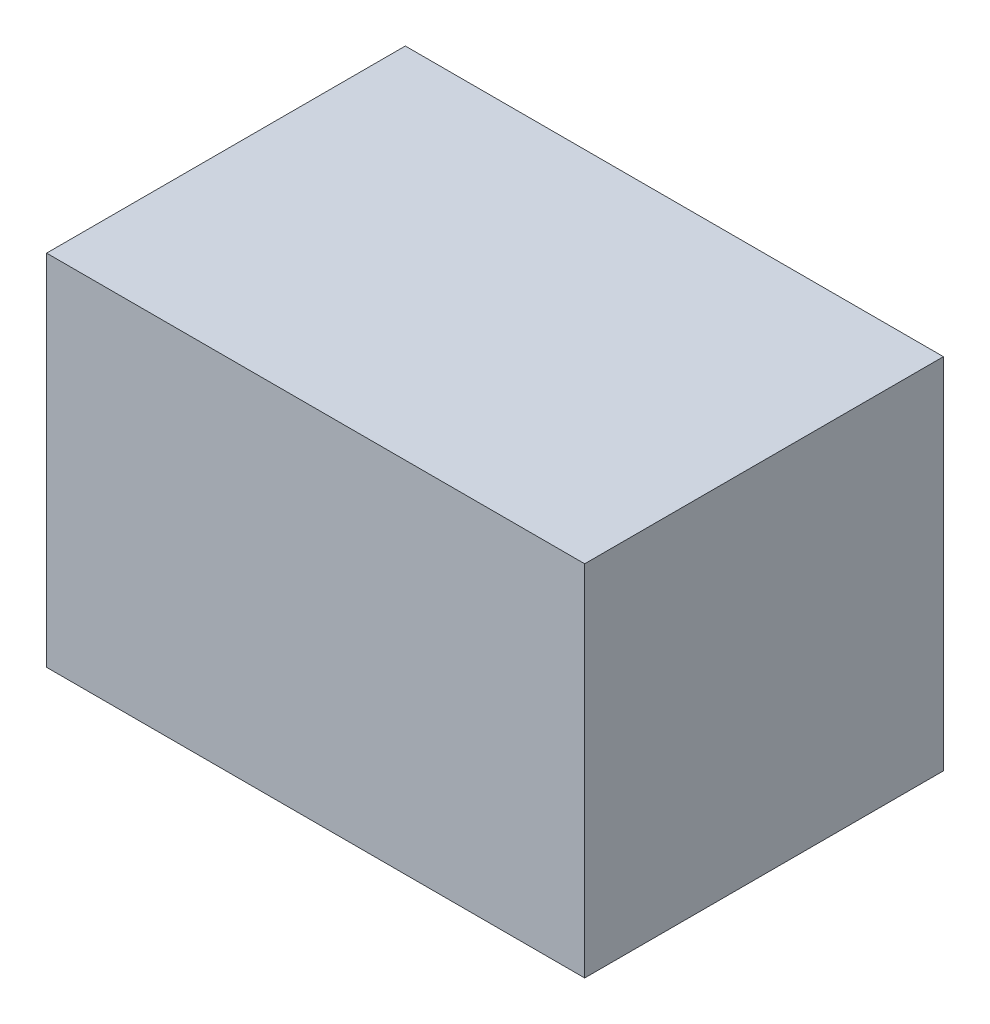
ISO-10303-21;
HEADER;
FILE_DESCRIPTION(('STEP AP214'),'2;1');
FILE_NAME('part.step','',(''),(''),'','','');
FILE_SCHEMA(('AUTOMOTIVE_DESIGN { 1 0 10303 214 1 1 1 1 }'));
ENDSEC;
DATA;
#1=APPLICATION_CONTEXT('core data for automotive mechanical design processes');
#2=APPLICATION_PROTOCOL_DEFINITION('international standard','automotive_design',2000,#1);
#3=PRODUCT_CONTEXT('',#1,'mechanical');
#4=PRODUCT('Part','Part','',(#3));
#5=PRODUCT_RELATED_PRODUCT_CATEGORY('part','',(#4));
#6=PRODUCT_DEFINITION_FORMATION('','',#4);
#7=PRODUCT_DEFINITION_CONTEXT('part definition',#1,'design');
#8=PRODUCT_DEFINITION('design','',#6,#7);
#9=PRODUCT_DEFINITION_SHAPE('','',#8);
#10=(LENGTH_UNIT() NAMED_UNIT(*) SI_UNIT(.MILLI.,.METRE.));
#11=(NAMED_UNIT(*) PLANE_ANGLE_UNIT() SI_UNIT($,.RADIAN.));
#12=(NAMED_UNIT(*) SI_UNIT($,.STERADIAN.) SOLID_ANGLE_UNIT());
#13=UNCERTAINTY_MEASURE_WITH_UNIT(LENGTH_MEASURE(1.E-05),#10,'distance_accuracy_value','');
#14=(GEOMETRIC_REPRESENTATION_CONTEXT(3) GLOBAL_UNCERTAINTY_ASSIGNED_CONTEXT((#13)) GLOBAL_UNIT_ASSIGNED_CONTEXT((#10,
#11,#12)) REPRESENTATION_CONTEXT('',''));
#15=CARTESIAN_POINT('',(0.,0.,0.));
#16=DIRECTION('',(0.,0.,1.));
#17=DIRECTION('',(1.,0.,0.));
#18=AXIS2_PLACEMENT_3D('',#15,#16,#17);
#19=CARTESIAN_POINT('',(-855.406451612903,1828.8,-781.664516129032));
#20=DIRECTION('',(1.,0.,0.));
#21=DIRECTION('',(0.,0.,-1.));
#22=AXIS2_PLACEMENT_3D('',#19,#20,#21);
#23=PLANE('',#22);
#24=DIRECTION('',(0.,0.,1.));
#25=VECTOR('',#24,1.);
#26=CARTESIAN_POINT('',(-855.406451612903,0.,-781.664516129032));
#27=LINE('',#26,#25);
#28=CARTESIAN_POINT('',(-855.406451612903,0.,-781.664516129032));
#29=VERTEX_POINT('',#28);
#30=CARTESIAN_POINT('',(-855.406451612903,0.,1047.13548387097));
#31=VERTEX_POINT('',#30);
#32=EDGE_CURVE('E109',#29,#31,#27,.T.);
#33=ORIENTED_EDGE('',*,*,#32,.T.);
#34=DIRECTION('',(0.,-1.,0.));
#35=VECTOR('',#34,1.);
#36=CARTESIAN_POINT('',(-855.406451612903,1828.8,1047.13548387097));
#37=LINE('',#36,#35);
#38=CARTESIAN_POINT('',(-855.406451612903,1828.8,1047.13548387097));
#39=VERTEX_POINT('',#38);
#40=EDGE_CURVE('E11',#39,#31,#37,.T.);
#41=ORIENTED_EDGE('',*,*,#40,.F.);
#42=DIRECTION('',(0.,0.,1.));
#43=VECTOR('',#42,1.);
#44=CARTESIAN_POINT('',(-855.406451612903,1828.8,-781.664516129032));
#45=LINE('',#44,#43);
#46=CARTESIAN_POINT('',(-855.406451612903,1828.8,-781.664516129032));
#47=VERTEX_POINT('',#46);
#48=EDGE_CURVE('E93',#47,#39,#45,.T.);
#49=ORIENTED_EDGE('',*,*,#48,.F.);
#50=DIRECTION('',(0.,-1.,0.));
#51=VECTOR('',#50,1.);
#52=CARTESIAN_POINT('',(-855.406451612903,1828.8,-781.664516129032));
#53=LINE('',#52,#51);
#54=EDGE_CURVE('E105',#47,#29,#53,.T.);
#55=ORIENTED_EDGE('',*,*,#54,.T.);
#56=EDGE_LOOP('',(#33,#41,#49,#55));
#57=FACE_BOUND('',#56,.T.);
#58=ADVANCED_FACE('F41',(#57),#23,.F.);
#59=CARTESIAN_POINT('',(-855.406451612903,1828.8,1047.13548387097));
#60=DIRECTION('',(0.,0.,-1.));
#61=DIRECTION('',(-1.,0.,0.));
#62=AXIS2_PLACEMENT_3D('',#59,#60,#61);
#63=PLANE('',#62);
#64=DIRECTION('',(1.,0.,0.));
#65=VECTOR('',#64,1.);
#66=CARTESIAN_POINT('',(-855.406451612903,0.,1047.13548387097));
#67=LINE('',#66,#65);
#68=CARTESIAN_POINT('',(1887.7935483871,0.,1047.13548387097));
#69=VERTEX_POINT('',#68);
#70=EDGE_CURVE('E98',#31,#69,#67,.T.);
#71=ORIENTED_EDGE('',*,*,#70,.T.);
#72=DIRECTION('',(0.,-1.,0.));
#73=VECTOR('',#72,1.);
#74=CARTESIAN_POINT('',(1887.7935483871,1828.8,1047.13548387097));
#75=LINE('',#74,#73);
#76=CARTESIAN_POINT('',(1887.7935483871,1828.8,1047.13548387097));
#77=VERTEX_POINT('',#76);
#78=EDGE_CURVE('E50',#77,#69,#75,.T.);
#79=ORIENTED_EDGE('',*,*,#78,.F.);
#80=DIRECTION('',(1.,0.,0.));
#81=VECTOR('',#80,1.);
#82=CARTESIAN_POINT('',(-855.406451612903,1828.8,1047.13548387097));
#83=LINE('',#82,#81);
#84=EDGE_CURVE('E88',#39,#77,#83,.T.);
#85=ORIENTED_EDGE('',*,*,#84,.F.);
#86=ORIENTED_EDGE('',*,*,#40,.T.);
#87=EDGE_LOOP('',(#71,#79,#85,#86));
#88=FACE_BOUND('',#87,.T.);
#89=ADVANCED_FACE('F97',(#88),#63,.F.);
#90=CARTESIAN_POINT('',(1887.7935483871,1828.8,-781.664516129032));
#91=DIRECTION('',(-1.,0.,0.));
#92=DIRECTION('',(0.,0.,1.));
#93=AXIS2_PLACEMENT_3D('',#90,#91,#92);
#94=PLANE('',#93);
#95=DIRECTION('',(0.,0.,-1.));
#96=VECTOR('',#95,1.);
#97=CARTESIAN_POINT('',(1887.7935483871,0.,-781.664516129032));
#98=LINE('',#97,#96);
#99=CARTESIAN_POINT('',(1887.7935483871,0.,-781.664516129032));
#100=VERTEX_POINT('',#99);
#101=EDGE_CURVE('E75',#69,#100,#98,.T.);
#102=ORIENTED_EDGE('',*,*,#101,.T.);
#103=DIRECTION('',(0.,-1.,0.));
#104=VECTOR('',#103,1.);
#105=CARTESIAN_POINT('',(1887.7935483871,1828.8,-781.664516129032));
#106=LINE('',#105,#104);
#107=CARTESIAN_POINT('',(1887.7935483871,1828.8,-781.664516129032));
#108=VERTEX_POINT('',#107);
#109=EDGE_CURVE('E100',#108,#100,#106,.T.);
#110=ORIENTED_EDGE('',*,*,#109,.F.);
#111=DIRECTION('',(0.,0.,-1.));
#112=VECTOR('',#111,1.);
#113=CARTESIAN_POINT('',(1887.7935483871,1828.8,-781.664516129032));
#114=LINE('',#113,#112);
#115=EDGE_CURVE('E91',#77,#108,#114,.T.);
#116=ORIENTED_EDGE('',*,*,#115,.F.);
#117=ORIENTED_EDGE('',*,*,#78,.T.);
#118=EDGE_LOOP('',(#102,#110,#116,#117));
#119=FACE_BOUND('',#118,.T.);
#120=ADVANCED_FACE('F101',(#119),#94,.F.);
#121=CARTESIAN_POINT('',(-855.406451612903,1828.8,-781.664516129032));
#122=DIRECTION('',(0.,0.,1.));
#123=DIRECTION('',(1.,0.,0.));
#124=AXIS2_PLACEMENT_3D('',#121,#122,#123);
#125=PLANE('',#124);
#126=DIRECTION('',(-1.,0.,0.));
#127=VECTOR('',#126,1.);
#128=CARTESIAN_POINT('',(-855.406451612903,0.,-781.664516129032));
#129=LINE('',#128,#127);
#130=EDGE_CURVE('E81',#100,#29,#129,.T.);
#131=ORIENTED_EDGE('',*,*,#130,.T.);
#132=ORIENTED_EDGE('',*,*,#54,.F.);
#133=DIRECTION('',(-1.,0.,0.));
#134=VECTOR('',#133,1.);
#135=CARTESIAN_POINT('',(-855.406451612903,1828.8,-781.664516129032));
#136=LINE('',#135,#134);
#137=EDGE_CURVE('E58',#108,#47,#136,.T.);
#138=ORIENTED_EDGE('',*,*,#137,.F.);
#139=ORIENTED_EDGE('',*,*,#109,.T.);
#140=EDGE_LOOP('',(#131,#132,#138,#139));
#141=FACE_BOUND('',#140,.T.);
#142=ADVANCED_FACE('F122',(#141),#125,.F.);
#143=CARTESIAN_POINT('',(0.,1828.8,0.));
#144=DIRECTION('',(0.,1.,0.));
#145=DIRECTION('',(0.,0.,1.));
#146=AXIS2_PLACEMENT_3D('',#143,#144,#145);
#147=PLANE('',#146);
#148=ORIENTED_EDGE('',*,*,#48,.T.);
#149=ORIENTED_EDGE('',*,*,#84,.T.);
#150=ORIENTED_EDGE('',*,*,#115,.T.);
#151=ORIENTED_EDGE('',*,*,#137,.T.);
#152=EDGE_LOOP('',(#148,#149,#150,#151));
#153=FACE_BOUND('',#152,.T.);
#154=ADVANCED_FACE('F89',(#153),#147,.T.);
#155=CARTESIAN_POINT('',(0.,0.,0.));
#156=DIRECTION('',(0.,1.,0.));
#157=DIRECTION('',(0.,0.,1.));
#158=AXIS2_PLACEMENT_3D('',#155,#156,#157);
#159=PLANE('',#158);
#160=ORIENTED_EDGE('',*,*,#32,.F.);
#161=ORIENTED_EDGE('',*,*,#130,.F.);
#162=ORIENTED_EDGE('',*,*,#101,.F.);
#163=ORIENTED_EDGE('',*,*,#70,.F.);
#164=EDGE_LOOP('',(#160,#161,#162,#163));
#165=FACE_BOUND('',#164,.T.);
#166=ADVANCED_FACE('F125',(#165),#159,.F.);
#167=CLOSED_SHELL('',(#58,#89,#120,#142,#154,#166));
#168=MANIFOLD_SOLID_BREP('B2',#167);
#169=ADVANCED_BREP_SHAPE_REPRESENTATION('',(#18,#168),#14);
#170=SHAPE_DEFINITION_REPRESENTATION(#9,#169);
ENDSEC;
END-ISO-10303-21;
